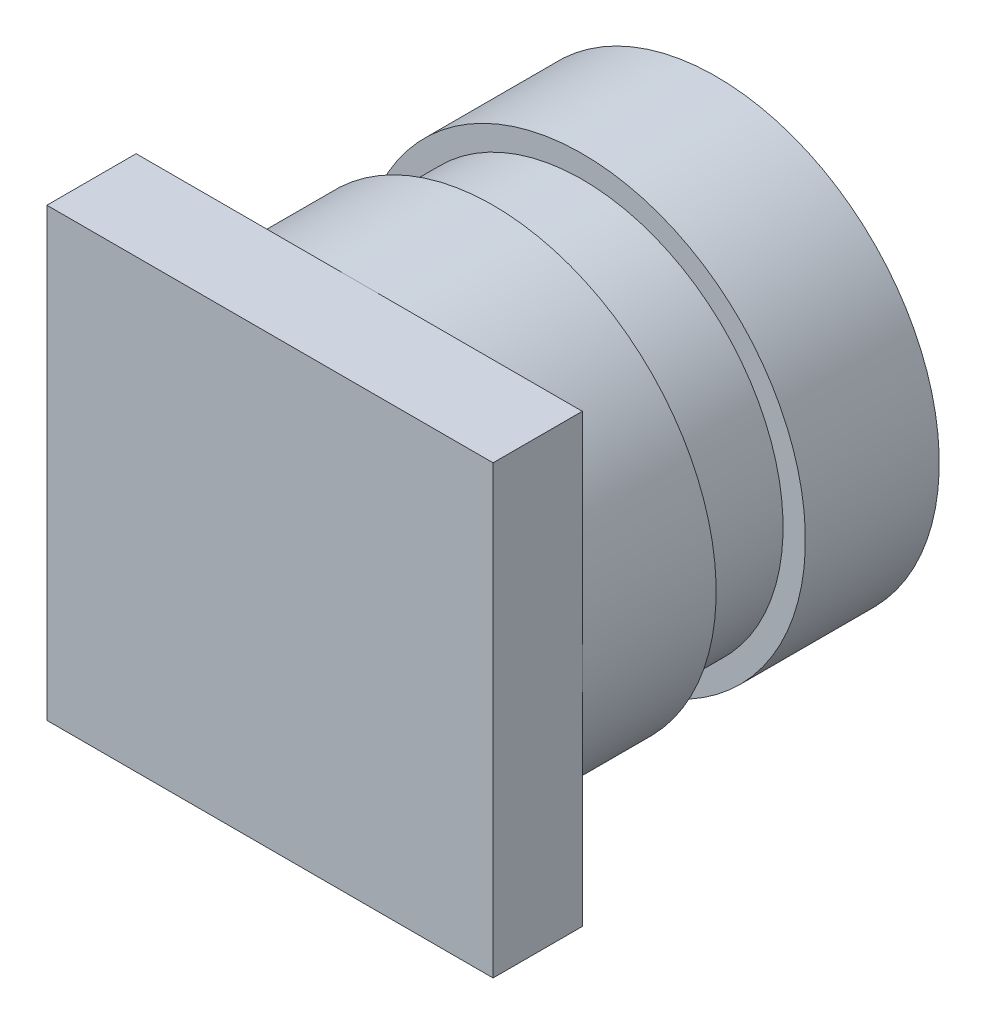
ISO-10303-21;
HEADER;
FILE_DESCRIPTION(('STEP AP214'),'2;1');
FILE_NAME('part.step','',(''),(''),'','','');
FILE_SCHEMA(('AUTOMOTIVE_DESIGN { 1 0 10303 214 1 1 1 1 }'));
ENDSEC;
DATA;
#1=APPLICATION_CONTEXT('core data for automotive mechanical design processes');
#2=APPLICATION_PROTOCOL_DEFINITION('international standard','automotive_design',2000,#1);
#3=PRODUCT_CONTEXT('',#1,'mechanical');
#4=PRODUCT('Part','Part','',(#3));
#5=PRODUCT_RELATED_PRODUCT_CATEGORY('part','',(#4));
#6=PRODUCT_DEFINITION_FORMATION('','',#4);
#7=PRODUCT_DEFINITION_CONTEXT('part definition',#1,'design');
#8=PRODUCT_DEFINITION('design','',#6,#7);
#9=PRODUCT_DEFINITION_SHAPE('','',#8);
#10=(LENGTH_UNIT() NAMED_UNIT(*) SI_UNIT(.MILLI.,.METRE.));
#11=(NAMED_UNIT(*) PLANE_ANGLE_UNIT() SI_UNIT($,.RADIAN.));
#12=(NAMED_UNIT(*) SI_UNIT($,.STERADIAN.) SOLID_ANGLE_UNIT());
#13=UNCERTAINTY_MEASURE_WITH_UNIT(LENGTH_MEASURE(1.E-05),#10,'distance_accuracy_value','');
#14=(GEOMETRIC_REPRESENTATION_CONTEXT(3) GLOBAL_UNCERTAINTY_ASSIGNED_CONTEXT((#13)) GLOBAL_UNIT_ASSIGNED_CONTEXT((#10,
#11,#12)) REPRESENTATION_CONTEXT('',''));
#15=CARTESIAN_POINT('',(0.,0.,0.));
#16=DIRECTION('',(0.,0.,1.));
#17=DIRECTION('',(1.,0.,0.));
#18=AXIS2_PLACEMENT_3D('',#15,#16,#17);
#19=CARTESIAN_POINT('',(0.,0.,0.));
#20=DIRECTION('',(0.,0.,-1.));
#21=DIRECTION('',(-1.,0.,0.));
#22=AXIS2_PLACEMENT_3D('',#19,#20,#21);
#23=PLANE('',#22);
#24=CARTESIAN_POINT('',(5.,1.73860374039595,0.));
#25=DIRECTION('',(0.,0.,-1.));
#26=DIRECTION('',(-1.,0.,0.));
#27=AXIS2_PLACEMENT_3D('',#24,#25,#26);
#28=CIRCLE('',#27,5.);
#29=CARTESIAN_POINT('',(0.,1.73860374039595,0.));
#30=VERTEX_POINT('',#29);
#31=CARTESIAN_POINT('',(5.,6.73860374039595,0.));
#32=VERTEX_POINT('',#31);
#33=EDGE_CURVE('E123',#30,#32,#28,.T.);
#34=ORIENTED_EDGE('',*,*,#33,.F.);
#35=DIRECTION('',(0.,-1.,0.));
#36=VECTOR('',#35,1.);
#37=CARTESIAN_POINT('',(0.,-3.26139625960405,0.));
#38=LINE('',#37,#36);
#39=CARTESIAN_POINT('',(0.,6.73860374039595,0.));
#40=VERTEX_POINT('',#39);
#41=EDGE_CURVE('E104',#40,#30,#38,.T.);
#42=ORIENTED_EDGE('',*,*,#41,.F.);
#43=DIRECTION('',(-1.,0.,0.));
#44=VECTOR('',#43,1.);
#45=CARTESIAN_POINT('',(0.,6.73860374039595,0.));
#46=LINE('',#45,#44);
#47=EDGE_CURVE('E124',#32,#40,#46,.T.);
#48=ORIENTED_EDGE('',*,*,#47,.F.);
#49=EDGE_LOOP('',(#34,#42,#48));
#50=FACE_BOUND('',#49,.T.);
#51=ADVANCED_FACE('F45',(#50),#23,.T.);
#52=CARTESIAN_POINT('',(10.,1.73860374039595,0.));
#53=VERTEX_POINT('',#52);
#54=EDGE_CURVE('E55',#32,#53,#28,.T.);
#55=ORIENTED_EDGE('',*,*,#54,.F.);
#56=CARTESIAN_POINT('',(10.,6.73860374039595,0.));
#57=VERTEX_POINT('',#56);
#58=EDGE_CURVE('E143',#57,#32,#46,.T.);
#59=ORIENTED_EDGE('',*,*,#58,.F.);
#60=DIRECTION('',(0.,1.,0.));
#61=VECTOR('',#60,1.);
#62=CARTESIAN_POINT('',(10.,-3.26139625960405,0.));
#63=LINE('',#62,#61);
#64=EDGE_CURVE('E154',#53,#57,#63,.T.);
#65=ORIENTED_EDGE('',*,*,#64,.F.);
#66=EDGE_LOOP('',(#55,#59,#65));
#67=FACE_BOUND('',#66,.T.);
#68=ADVANCED_FACE('F234',(#67),#23,.T.);
#69=CARTESIAN_POINT('',(5.,-3.26139625960405,0.));
#70=VERTEX_POINT('',#69);
#71=EDGE_CURVE('E70',#53,#70,#28,.T.);
#72=ORIENTED_EDGE('',*,*,#71,.F.);
#73=CARTESIAN_POINT('',(10.,-3.26139625960405,0.));
#74=VERTEX_POINT('',#73);
#75=EDGE_CURVE('E155',#74,#53,#63,.T.);
#76=ORIENTED_EDGE('',*,*,#75,.F.);
#77=DIRECTION('',(1.,0.,0.));
#78=VECTOR('',#77,1.);
#79=CARTESIAN_POINT('',(0.,-3.26139625960405,0.));
#80=LINE('',#79,#78);
#81=EDGE_CURVE('E114',#70,#74,#80,.T.);
#82=ORIENTED_EDGE('',*,*,#81,.F.);
#83=EDGE_LOOP('',(#72,#76,#82));
#84=FACE_BOUND('',#83,.T.);
#85=ADVANCED_FACE('F174',(#84),#23,.T.);
#86=CARTESIAN_POINT('',(0.,-3.26139625960405,2.));
#87=DIRECTION('',(1.,0.,0.));
#88=DIRECTION('',(0.,0.,-1.));
#89=AXIS2_PLACEMENT_3D('',#86,#87,#88);
#90=PLANE('',#89);
#91=ORIENTED_EDGE('',*,*,#41,.T.);
#92=CARTESIAN_POINT('',(0.,-3.26139625960405,0.));
#93=VERTEX_POINT('',#92);
#94=EDGE_CURVE('E106',#30,#93,#38,.T.);
#95=ORIENTED_EDGE('',*,*,#94,.T.);
#96=DIRECTION('',(0.,0.,-1.));
#97=VECTOR('',#96,1.);
#98=CARTESIAN_POINT('',(0.,-3.26139625960405,2.));
#99=LINE('',#98,#97);
#100=CARTESIAN_POINT('',(0.,-3.26139625960405,2.));
#101=VERTEX_POINT('',#100);
#102=EDGE_CURVE('E49',#101,#93,#99,.T.);
#103=ORIENTED_EDGE('',*,*,#102,.F.);
#104=DIRECTION('',(0.,-1.,0.));
#105=VECTOR('',#104,1.);
#106=CARTESIAN_POINT('',(0.,-3.26139625960405,2.));
#107=LINE('',#106,#105);
#108=CARTESIAN_POINT('',(0.,6.73860374039595,2.));
#109=VERTEX_POINT('',#108);
#110=EDGE_CURVE('E138',#109,#101,#107,.T.);
#111=ORIENTED_EDGE('',*,*,#110,.F.);
#112=DIRECTION('',(0.,0.,-1.));
#113=VECTOR('',#112,1.);
#114=CARTESIAN_POINT('',(0.,6.73860374039595,2.));
#115=LINE('',#114,#113);
#116=EDGE_CURVE('E109',#109,#40,#115,.T.);
#117=ORIENTED_EDGE('',*,*,#116,.T.);
#118=EDGE_LOOP('',(#91,#95,#103,#111,#117));
#119=FACE_BOUND('',#118,.T.);
#120=ADVANCED_FACE('F47',(#119),#90,.F.);
#121=CARTESIAN_POINT('',(0.,-3.26139625960405,2.));
#122=DIRECTION('',(0.,1.,0.));
#123=DIRECTION('',(0.,0.,1.));
#124=AXIS2_PLACEMENT_3D('',#121,#122,#123);
#125=PLANE('',#124);
#126=EDGE_CURVE('E118',#93,#70,#80,.T.);
#127=ORIENTED_EDGE('',*,*,#126,.T.);
#128=ORIENTED_EDGE('',*,*,#81,.T.);
#129=DIRECTION('',(0.,0.,-1.));
#130=VECTOR('',#129,1.);
#131=CARTESIAN_POINT('',(10.,-3.26139625960405,2.));
#132=LINE('',#131,#130);
#133=CARTESIAN_POINT('',(10.,-3.26139625960405,2.));
#134=VERTEX_POINT('',#133);
#135=EDGE_CURVE('E135',#134,#74,#132,.T.);
#136=ORIENTED_EDGE('',*,*,#135,.F.);
#137=DIRECTION('',(1.,0.,0.));
#138=VECTOR('',#137,1.);
#139=CARTESIAN_POINT('',(0.,-3.26139625960405,2.));
#140=LINE('',#139,#138);
#141=EDGE_CURVE('E142',#101,#134,#140,.T.);
#142=ORIENTED_EDGE('',*,*,#141,.F.);
#143=ORIENTED_EDGE('',*,*,#102,.T.);
#144=EDGE_LOOP('',(#127,#128,#136,#142,#143));
#145=FACE_BOUND('',#144,.T.);
#146=ADVANCED_FACE('F176',(#145),#125,.F.);
#147=CARTESIAN_POINT('',(10.,-3.26139625960405,2.));
#148=DIRECTION('',(-1.,0.,0.));
#149=DIRECTION('',(0.,0.,1.));
#150=AXIS2_PLACEMENT_3D('',#147,#148,#149);
#151=PLANE('',#150);
#152=ORIENTED_EDGE('',*,*,#75,.T.);
#153=ORIENTED_EDGE('',*,*,#64,.T.);
#154=DIRECTION('',(0.,0.,-1.));
#155=VECTOR('',#154,1.);
#156=CARTESIAN_POINT('',(10.,6.73860374039595,2.));
#157=LINE('',#156,#155);
#158=CARTESIAN_POINT('',(10.,6.73860374039595,2.));
#159=VERTEX_POINT('',#158);
#160=EDGE_CURVE('E163',#159,#57,#157,.T.);
#161=ORIENTED_EDGE('',*,*,#160,.F.);
#162=DIRECTION('',(0.,1.,0.));
#163=VECTOR('',#162,1.);
#164=CARTESIAN_POINT('',(10.,-3.26139625960405,2.));
#165=LINE('',#164,#163);
#166=EDGE_CURVE('E146',#134,#159,#165,.T.);
#167=ORIENTED_EDGE('',*,*,#166,.F.);
#168=ORIENTED_EDGE('',*,*,#135,.T.);
#169=EDGE_LOOP('',(#152,#153,#161,#167,#168));
#170=FACE_BOUND('',#169,.T.);
#171=ADVANCED_FACE('F171',(#170),#151,.F.);
#172=CARTESIAN_POINT('',(0.,6.73860374039595,2.));
#173=DIRECTION('',(0.,-1.,0.));
#174=DIRECTION('',(0.,0.,-1.));
#175=AXIS2_PLACEMENT_3D('',#172,#173,#174);
#176=PLANE('',#175);
#177=ORIENTED_EDGE('',*,*,#58,.T.);
#178=ORIENTED_EDGE('',*,*,#47,.T.);
#179=ORIENTED_EDGE('',*,*,#116,.F.);
#180=DIRECTION('',(-1.,0.,0.));
#181=VECTOR('',#180,1.);
#182=CARTESIAN_POINT('',(0.,6.73860374039595,2.));
#183=LINE('',#182,#181);
#184=EDGE_CURVE('E149',#159,#109,#183,.T.);
#185=ORIENTED_EDGE('',*,*,#184,.F.);
#186=ORIENTED_EDGE('',*,*,#160,.T.);
#187=EDGE_LOOP('',(#177,#178,#179,#185,#186));
#188=FACE_BOUND('',#187,.T.);
#189=ADVANCED_FACE('F181',(#188),#176,.F.);
#190=CARTESIAN_POINT('',(0.,0.,2.));
#191=DIRECTION('',(0.,0.,-1.));
#192=DIRECTION('',(-1.,0.,0.));
#193=AXIS2_PLACEMENT_3D('',#190,#191,#192);
#194=PLANE('',#193);
#195=ORIENTED_EDGE('',*,*,#110,.T.);
#196=ORIENTED_EDGE('',*,*,#141,.T.);
#197=ORIENTED_EDGE('',*,*,#166,.T.);
#198=ORIENTED_EDGE('',*,*,#184,.T.);
#199=EDGE_LOOP('',(#195,#196,#197,#198));
#200=FACE_BOUND('',#199,.T.);
#201=ADVANCED_FACE('F178',(#200),#194,.F.);
#202=EDGE_CURVE('E63',#70,#30,#28,.T.);
#203=ORIENTED_EDGE('',*,*,#202,.F.);
#204=ORIENTED_EDGE('',*,*,#126,.F.);
#205=ORIENTED_EDGE('',*,*,#94,.F.);
#206=EDGE_LOOP('',(#203,#204,#205));
#207=FACE_BOUND('',#206,.T.);
#208=ADVANCED_FACE('F116',(#207),#23,.T.);
#209=CARTESIAN_POINT('',(5.,1.73860374039595,-3.));
#210=DIRECTION('',(0.,0.,1.));
#211=DIRECTION('',(1.,0.,0.));
#212=AXIS2_PLACEMENT_3D('',#209,#210,#211);
#213=CYLINDRICAL_SURFACE('',#212,5.);
#214=CARTESIAN_POINT('',(5.,1.73860374039595,-3.));
#215=DIRECTION('',(0.,0.,-1.));
#216=DIRECTION('',(-1.,0.,0.));
#217=AXIS2_PLACEMENT_3D('',#214,#215,#216);
#218=CIRCLE('',#217,5.);
#219=CARTESIAN_POINT('',(0.,1.73860374039595,-3.));
#220=VERTEX_POINT('',#219);
#221=EDGE_CURVE('E121',#220,#220,#218,.T.);
#222=ORIENTED_EDGE('',*,*,#221,.F.);
#223=EDGE_LOOP('',(#222));
#224=FACE_BOUND('',#223,.T.);
#225=ORIENTED_EDGE('',*,*,#33,.T.);
#226=ORIENTED_EDGE('',*,*,#54,.T.);
#227=ORIENTED_EDGE('',*,*,#71,.T.);
#228=ORIENTED_EDGE('',*,*,#202,.T.);
#229=EDGE_LOOP('',(#225,#226,#227,#228));
#230=FACE_BOUND('',#229,.T.);
#231=ADVANCED_FACE('F131',(#224,#230),#213,.T.);
#232=CARTESIAN_POINT('',(0.,0.,-3.));
#233=DIRECTION('',(0.,0.,-1.));
#234=DIRECTION('',(-1.,0.,0.));
#235=AXIS2_PLACEMENT_3D('',#232,#233,#234);
#236=PLANE('',#235);
#237=CARTESIAN_POINT('',(5.,1.73860374039595,-3.));
#238=DIRECTION('',(0.,0.,-1.));
#239=DIRECTION('',(-1.,0.,0.));
#240=AXIS2_PLACEMENT_3D('',#237,#238,#239);
#241=CIRCLE('',#240,4.5);
#242=CARTESIAN_POINT('',(0.5,1.73860374039595,-3.));
#243=VERTEX_POINT('',#242);
#244=EDGE_CURVE('E11',#243,#243,#241,.T.);
#245=ORIENTED_EDGE('',*,*,#244,.F.);
#246=EDGE_LOOP('',(#245));
#247=FACE_BOUND('',#246,.T.);
#248=ORIENTED_EDGE('',*,*,#221,.T.);
#249=EDGE_LOOP('',(#248));
#250=FACE_BOUND('',#249,.T.);
#251=ADVANCED_FACE('F247',(#247,#250),#236,.T.);
#252=CARTESIAN_POINT('',(5.,1.73860374039595,-5.));
#253=DIRECTION('',(0.,0.,1.));
#254=DIRECTION('',(1.,0.,0.));
#255=AXIS2_PLACEMENT_3D('',#252,#253,#254);
#256=CYLINDRICAL_SURFACE('',#255,4.5);
#257=CARTESIAN_POINT('',(5.,1.73860374039595,-5.));
#258=DIRECTION('',(0.,0.,-1.));
#259=DIRECTION('',(-1.,0.,0.));
#260=AXIS2_PLACEMENT_3D('',#257,#258,#259);
#261=CIRCLE('',#260,4.5);
#262=CARTESIAN_POINT('',(0.5,1.73860374039595,-5.));
#263=VERTEX_POINT('',#262);
#264=EDGE_CURVE('E129',#263,#263,#261,.T.);
#265=ORIENTED_EDGE('',*,*,#264,.F.);
#266=EDGE_LOOP('',(#265));
#267=FACE_BOUND('',#266,.T.);
#268=ORIENTED_EDGE('',*,*,#244,.T.);
#269=EDGE_LOOP('',(#268));
#270=FACE_BOUND('',#269,.T.);
#271=ADVANCED_FACE('F220',(#267,#270),#256,.T.);
#272=CARTESIAN_POINT('',(5.,1.73860374039595,-8.));
#273=DIRECTION('',(0.,0.,1.));
#274=DIRECTION('',(1.,0.,0.));
#275=AXIS2_PLACEMENT_3D('',#272,#273,#274);
#276=CYLINDRICAL_SURFACE('',#275,5.);
#277=CARTESIAN_POINT('',(5.,1.73860374039595,-8.));
#278=DIRECTION('',(0.,0.,-1.));
#279=DIRECTION('',(-1.,0.,0.));
#280=AXIS2_PLACEMENT_3D('',#277,#278,#279);
#281=CIRCLE('',#280,5.);
#282=CARTESIAN_POINT('',(0.,1.73860374039595,-8.));
#283=VERTEX_POINT('',#282);
#284=EDGE_CURVE('E190',#283,#283,#281,.T.);
#285=ORIENTED_EDGE('',*,*,#284,.F.);
#286=EDGE_LOOP('',(#285));
#287=FACE_BOUND('',#286,.T.);
#288=CARTESIAN_POINT('',(5.,1.73860374039595,-5.));
#289=DIRECTION('',(0.,0.,-1.));
#290=DIRECTION('',(-1.,0.,0.));
#291=AXIS2_PLACEMENT_3D('',#288,#289,#290);
#292=CIRCLE('',#291,5.);
#293=CARTESIAN_POINT('',(0.,1.73860374039595,-5.));
#294=VERTEX_POINT('',#293);
#295=EDGE_CURVE('E194',#294,#294,#292,.T.);
#296=ORIENTED_EDGE('',*,*,#295,.T.);
#297=EDGE_LOOP('',(#296));
#298=FACE_BOUND('',#297,.T.);
#299=ADVANCED_FACE('F214',(#287,#298),#276,.T.);
#300=CARTESIAN_POINT('',(0.,0.,-8.));
#301=DIRECTION('',(0.,0.,-1.));
#302=DIRECTION('',(-1.,0.,0.));
#303=AXIS2_PLACEMENT_3D('',#300,#301,#302);
#304=PLANE('',#303);
#305=CARTESIAN_POINT('',(5.,1.73860374039595,-8.));
#306=DIRECTION('',(0.,0.,-1.));
#307=DIRECTION('',(-1.,0.,0.));
#308=AXIS2_PLACEMENT_3D('',#305,#306,#307);
#309=CIRCLE('',#308,4.5);
#310=CARTESIAN_POINT('',(0.5,1.73860374039595,-8.));
#311=VERTEX_POINT('',#310);
#312=EDGE_CURVE('E202',#311,#311,#309,.T.);
#313=ORIENTED_EDGE('',*,*,#312,.F.);
#314=EDGE_LOOP('',(#313));
#315=FACE_BOUND('',#314,.T.);
#316=ORIENTED_EDGE('',*,*,#284,.T.);
#317=EDGE_LOOP('',(#316));
#318=FACE_BOUND('',#317,.T.);
#319=ADVANCED_FACE('F210',(#315,#318),#304,.T.);
#320=CARTESIAN_POINT('',(0.,0.,-5.));
#321=DIRECTION('',(0.,0.,-1.));
#322=DIRECTION('',(-1.,0.,0.));
#323=AXIS2_PLACEMENT_3D('',#320,#321,#322);
#324=PLANE('',#323);
#325=ORIENTED_EDGE('',*,*,#264,.T.);
#326=EDGE_LOOP('',(#325));
#327=FACE_BOUND('',#326,.T.);
#328=ORIENTED_EDGE('',*,*,#295,.F.);
#329=EDGE_LOOP('',(#328));
#330=FACE_BOUND('',#329,.T.);
#331=ADVANCED_FACE('F213',(#327,#330),#324,.F.);
#332=CARTESIAN_POINT('',(5.,1.73860374039595,-7.));
#333=DIRECTION('',(0.,0.,-1.));
#334=DIRECTION('',(-1.,0.,0.));
#335=AXIS2_PLACEMENT_3D('',#332,#333,#334);
#336=CYLINDRICAL_SURFACE('',#335,4.5);
#337=CARTESIAN_POINT('',(5.,1.73860374039595,-7.));
#338=DIRECTION('',(0.,0.,-1.));
#339=DIRECTION('',(-1.,0.,0.));
#340=AXIS2_PLACEMENT_3D('',#337,#338,#339);
#341=CIRCLE('',#340,4.5);
#342=CARTESIAN_POINT('',(0.5,1.73860374039595,-7.));
#343=VERTEX_POINT('',#342);
#344=EDGE_CURVE('E198',#343,#343,#341,.T.);
#345=ORIENTED_EDGE('',*,*,#344,.F.);
#346=EDGE_LOOP('',(#345));
#347=FACE_BOUND('',#346,.T.);
#348=ORIENTED_EDGE('',*,*,#312,.T.);
#349=EDGE_LOOP('',(#348));
#350=FACE_BOUND('',#349,.T.);
#351=ADVANCED_FACE('F208',(#347,#350),#336,.F.);
#352=CARTESIAN_POINT('',(0.,0.,-7.));
#353=DIRECTION('',(0.,0.,-1.));
#354=DIRECTION('',(-1.,0.,0.));
#355=AXIS2_PLACEMENT_3D('',#352,#353,#354);
#356=PLANE('',#355);
#357=ORIENTED_EDGE('',*,*,#344,.T.);
#358=EDGE_LOOP('',(#357));
#359=FACE_BOUND('',#358,.T.);
#360=ADVANCED_FACE('F230',(#359),#356,.T.);
#361=CLOSED_SHELL('',(#51,#68,#85,#120,#146,#171,#189,#201,#208,#231,#251,#271,#299,#319,#331,
#351,#360));
#362=MANIFOLD_SOLID_BREP('B2',#361);
#363=ADVANCED_BREP_SHAPE_REPRESENTATION('',(#18,#362),#14);
#364=SHAPE_DEFINITION_REPRESENTATION(#9,#363);
ENDSEC;
END-ISO-10303-21;
